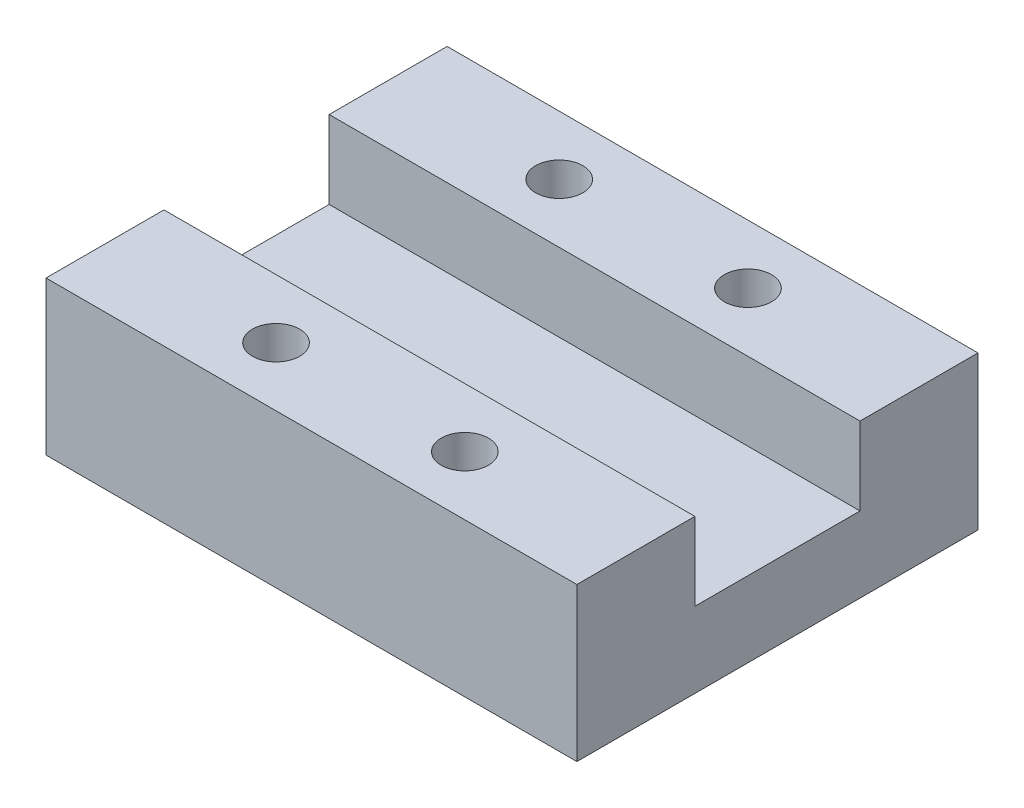
ISO-10303-21;
HEADER;
FILE_DESCRIPTION(('STEP AP214'),'2;1');
FILE_NAME('part.step','',(''),(''),'','','');
FILE_SCHEMA(('AUTOMOTIVE_DESIGN { 1 0 10303 214 1 1 1 1 }'));
ENDSEC;
DATA;
#1=APPLICATION_CONTEXT('core data for automotive mechanical design processes');
#2=APPLICATION_PROTOCOL_DEFINITION('international standard','automotive_design',2000,#1);
#3=PRODUCT_CONTEXT('',#1,'mechanical');
#4=PRODUCT('Part','Part','',(#3));
#5=PRODUCT_RELATED_PRODUCT_CATEGORY('part','',(#4));
#6=PRODUCT_DEFINITION_FORMATION('','',#4);
#7=PRODUCT_DEFINITION_CONTEXT('part definition',#1,'design');
#8=PRODUCT_DEFINITION('design','',#6,#7);
#9=PRODUCT_DEFINITION_SHAPE('','',#8);
#10=(LENGTH_UNIT() NAMED_UNIT(*) SI_UNIT(.MILLI.,.METRE.));
#11=(NAMED_UNIT(*) PLANE_ANGLE_UNIT() SI_UNIT($,.RADIAN.));
#12=(NAMED_UNIT(*) SI_UNIT($,.STERADIAN.) SOLID_ANGLE_UNIT());
#13=UNCERTAINTY_MEASURE_WITH_UNIT(LENGTH_MEASURE(1.E-05),#10,'distance_accuracy_value','');
#14=(GEOMETRIC_REPRESENTATION_CONTEXT(3) GLOBAL_UNCERTAINTY_ASSIGNED_CONTEXT((#13)) GLOBAL_UNIT_ASSIGNED_CONTEXT((#10,
#11,#12)) REPRESENTATION_CONTEXT('',''));
#15=CARTESIAN_POINT('',(0.,0.,0.));
#16=DIRECTION('',(0.,0.,1.));
#17=DIRECTION('',(1.,0.,0.));
#18=AXIS2_PLACEMENT_3D('',#15,#16,#17);
#19=CARTESIAN_POINT('',(0.,3.2,0.));
#20=DIRECTION('',(0.,1.,0.));
#21=DIRECTION('',(0.,0.,1.));
#22=AXIS2_PLACEMENT_3D('',#19,#20,#21);
#23=PLANE('',#22);
#24=DIRECTION('',(0.,0.,1.));
#25=VECTOR('',#24,1.);
#26=CARTESIAN_POINT('',(-11.25,3.2,-8.5));
#27=LINE('',#26,#25);
#28=CARTESIAN_POINT('',(-11.25,3.2,-3.5));
#29=VERTEX_POINT('',#28);
#30=CARTESIAN_POINT('',(-11.25,3.2,3.5));
#31=VERTEX_POINT('',#30);
#32=EDGE_CURVE('E58',#29,#31,#27,.T.);
#33=ORIENTED_EDGE('',*,*,#32,.T.);
#34=DIRECTION('',(-1.,0.,0.));
#35=VECTOR('',#34,1.);
#36=CARTESIAN_POINT('',(-11.25,3.2,3.5));
#37=LINE('',#36,#35);
#38=CARTESIAN_POINT('',(11.25,3.2,3.5));
#39=VERTEX_POINT('',#38);
#40=EDGE_CURVE('E53',#39,#31,#37,.T.);
#41=ORIENTED_EDGE('',*,*,#40,.F.);
#42=DIRECTION('',(0.,0.,-1.));
#43=VECTOR('',#42,1.);
#44=CARTESIAN_POINT('',(11.25,3.2,-8.5));
#45=LINE('',#44,#43);
#46=CARTESIAN_POINT('',(11.25,3.2,-3.5));
#47=VERTEX_POINT('',#46);
#48=EDGE_CURVE('E179',#39,#47,#45,.T.);
#49=ORIENTED_EDGE('',*,*,#48,.T.);
#50=DIRECTION('',(1.,0.,0.));
#51=VECTOR('',#50,1.);
#52=CARTESIAN_POINT('',(-11.25,3.2,-3.5));
#53=LINE('',#52,#51);
#54=EDGE_CURVE('E146',#29,#47,#53,.T.);
#55=ORIENTED_EDGE('',*,*,#54,.F.);
#56=EDGE_LOOP('',(#33,#41,#49,#55));
#57=FACE_BOUND('',#56,.T.);
#58=ADVANCED_FACE('F38',(#57),#23,.T.);
#59=CARTESIAN_POINT('',(0.,0.,0.));
#60=DIRECTION('',(0.,1.,0.));
#61=DIRECTION('',(0.,0.,1.));
#62=AXIS2_PLACEMENT_3D('',#59,#60,#61);
#63=PLANE('',#62);
#64=DIRECTION('',(0.,0.,-1.));
#65=VECTOR('',#64,1.);
#66=CARTESIAN_POINT('',(11.25,0.,-8.5));
#67=LINE('',#66,#65);
#68=CARTESIAN_POINT('',(11.25,0.,8.5));
#69=VERTEX_POINT('',#68);
#70=CARTESIAN_POINT('',(11.25,0.,-8.5));
#71=VERTEX_POINT('',#70);
#72=EDGE_CURVE('E178',#69,#71,#67,.T.);
#73=ORIENTED_EDGE('',*,*,#72,.F.);
#74=DIRECTION('',(1.,0.,0.));
#75=VECTOR('',#74,1.);
#76=CARTESIAN_POINT('',(-11.25,0.,8.5));
#77=LINE('',#76,#75);
#78=CARTESIAN_POINT('',(-11.25,0.,8.5));
#79=VERTEX_POINT('',#78);
#80=EDGE_CURVE('E181',#79,#69,#77,.T.);
#81=ORIENTED_EDGE('',*,*,#80,.F.);
#82=DIRECTION('',(0.,0.,1.));
#83=VECTOR('',#82,1.);
#84=CARTESIAN_POINT('',(-11.25,0.,-8.5));
#85=LINE('',#84,#83);
#86=CARTESIAN_POINT('',(-11.25,0.,-8.5));
#87=VERTEX_POINT('',#86);
#88=EDGE_CURVE('E109',#87,#79,#85,.T.);
#89=ORIENTED_EDGE('',*,*,#88,.F.);
#90=DIRECTION('',(-1.,0.,0.));
#91=VECTOR('',#90,1.);
#92=CARTESIAN_POINT('',(-11.25,0.,-8.5));
#93=LINE('',#92,#91);
#94=EDGE_CURVE('E185',#71,#87,#93,.T.);
#95=ORIENTED_EDGE('',*,*,#94,.F.);
#96=EDGE_LOOP('',(#73,#81,#89,#95));
#97=FACE_BOUND('',#96,.T.);
#98=CARTESIAN_POINT('',(4.,0.,-6.));
#99=DIRECTION('',(0.,1.,0.));
#100=DIRECTION('',(0.,0.,1.));
#101=AXIS2_PLACEMENT_3D('',#98,#99,#100);
#102=CIRCLE('',#101,1.);
#103=CARTESIAN_POINT('',(4.,0.,-5.));
#104=VERTEX_POINT('',#103);
#105=EDGE_CURVE('E175',#104,#104,#102,.T.);
#106=ORIENTED_EDGE('',*,*,#105,.T.);
#107=EDGE_LOOP('',(#106));
#108=FACE_BOUND('',#107,.T.);
#109=CARTESIAN_POINT('',(-4.,0.,-6.));
#110=DIRECTION('',(0.,1.,0.));
#111=DIRECTION('',(0.,0.,1.));
#112=AXIS2_PLACEMENT_3D('',#109,#110,#111);
#113=CIRCLE('',#112,1.);
#114=CARTESIAN_POINT('',(-4.,0.,-5.));
#115=VERTEX_POINT('',#114);
#116=EDGE_CURVE('E172',#115,#115,#113,.T.);
#117=ORIENTED_EDGE('',*,*,#116,.T.);
#118=EDGE_LOOP('',(#117));
#119=FACE_BOUND('',#118,.T.);
#120=CARTESIAN_POINT('',(-4.,0.,6.));
#121=DIRECTION('',(0.,1.,0.));
#122=DIRECTION('',(0.,0.,1.));
#123=AXIS2_PLACEMENT_3D('',#120,#121,#122);
#124=CIRCLE('',#123,1.);
#125=CARTESIAN_POINT('',(-4.,0.,7.));
#126=VERTEX_POINT('',#125);
#127=EDGE_CURVE('E169',#126,#126,#124,.T.);
#128=ORIENTED_EDGE('',*,*,#127,.T.);
#129=EDGE_LOOP('',(#128));
#130=FACE_BOUND('',#129,.T.);
#131=CARTESIAN_POINT('',(4.,0.,6.));
#132=DIRECTION('',(0.,1.,0.));
#133=DIRECTION('',(0.,0.,1.));
#134=AXIS2_PLACEMENT_3D('',#131,#132,#133);
#135=CIRCLE('',#134,1.);
#136=CARTESIAN_POINT('',(4.,0.,7.));
#137=VERTEX_POINT('',#136);
#138=EDGE_CURVE('E166',#137,#137,#135,.T.);
#139=ORIENTED_EDGE('',*,*,#138,.T.);
#140=EDGE_LOOP('',(#139));
#141=FACE_BOUND('',#140,.T.);
#142=ADVANCED_FACE('F195',(#97,#108,#119,#130,#141),#63,.F.);
#143=CARTESIAN_POINT('',(11.25,3.2,-8.5));
#144=DIRECTION('',(-1.,0.,0.));
#145=DIRECTION('',(0.,0.,1.));
#146=AXIS2_PLACEMENT_3D('',#143,#144,#145);
#147=PLANE('',#146);
#148=ORIENTED_EDGE('',*,*,#72,.T.);
#149=DIRECTION('',(0.,-1.,0.));
#150=VECTOR('',#149,1.);
#151=CARTESIAN_POINT('',(11.25,3.2,-8.5));
#152=LINE('',#151,#150);
#153=CARTESIAN_POINT('',(11.25,6.5,-8.5));
#154=VERTEX_POINT('',#153);
#155=EDGE_CURVE('E11',#154,#71,#152,.T.);
#156=ORIENTED_EDGE('',*,*,#155,.F.);
#157=DIRECTION('',(0.,0.,-1.));
#158=VECTOR('',#157,1.);
#159=CARTESIAN_POINT('',(11.25,6.5,-8.5));
#160=LINE('',#159,#158);
#161=CARTESIAN_POINT('',(11.25,6.5,-3.5));
#162=VERTEX_POINT('',#161);
#163=EDGE_CURVE('E152',#162,#154,#160,.T.);
#164=ORIENTED_EDGE('',*,*,#163,.F.);
#165=DIRECTION('',(0.,-1.,0.));
#166=VECTOR('',#165,1.);
#167=CARTESIAN_POINT('',(11.25,6.5,-3.5));
#168=LINE('',#167,#166);
#169=EDGE_CURVE('E158',#162,#47,#168,.T.);
#170=ORIENTED_EDGE('',*,*,#169,.T.);
#171=ORIENTED_EDGE('',*,*,#48,.F.);
#172=DIRECTION('',(0.,-1.,0.));
#173=VECTOR('',#172,1.);
#174=CARTESIAN_POINT('',(11.25,6.5,3.5));
#175=LINE('',#174,#173);
#176=CARTESIAN_POINT('',(11.25,6.5,3.5));
#177=VERTEX_POINT('',#176);
#178=EDGE_CURVE('E137',#177,#39,#175,.T.);
#179=ORIENTED_EDGE('',*,*,#178,.F.);
#180=DIRECTION('',(0.,0.,-1.));
#181=VECTOR('',#180,1.);
#182=CARTESIAN_POINT('',(11.25,6.5,8.5));
#183=LINE('',#182,#181);
#184=CARTESIAN_POINT('',(11.25,6.5,8.5));
#185=VERTEX_POINT('',#184);
#186=EDGE_CURVE('E120',#185,#177,#183,.T.);
#187=ORIENTED_EDGE('',*,*,#186,.F.);
#188=DIRECTION('',(0.,-1.,0.));
#189=VECTOR('',#188,1.);
#190=CARTESIAN_POINT('',(11.25,3.2,8.5));
#191=LINE('',#190,#189);
#192=EDGE_CURVE('E112',#185,#69,#191,.T.);
#193=ORIENTED_EDGE('',*,*,#192,.T.);
#194=EDGE_LOOP('',(#148,#156,#164,#170,#171,#179,#187,#193));
#195=FACE_BOUND('',#194,.T.);
#196=ADVANCED_FACE('F40',(#195),#147,.F.);
#197=CARTESIAN_POINT('',(-11.25,3.2,-8.5));
#198=DIRECTION('',(0.,0.,1.));
#199=DIRECTION('',(1.,0.,0.));
#200=AXIS2_PLACEMENT_3D('',#197,#198,#199);
#201=PLANE('',#200);
#202=ORIENTED_EDGE('',*,*,#94,.T.);
#203=DIRECTION('',(0.,-1.,0.));
#204=VECTOR('',#203,1.);
#205=CARTESIAN_POINT('',(-11.25,3.2,-8.5));
#206=LINE('',#205,#204);
#207=CARTESIAN_POINT('',(-11.25,6.5,-8.5));
#208=VERTEX_POINT('',#207);
#209=EDGE_CURVE('E46',#208,#87,#206,.T.);
#210=ORIENTED_EDGE('',*,*,#209,.F.);
#211=DIRECTION('',(-1.,0.,0.));
#212=VECTOR('',#211,1.);
#213=CARTESIAN_POINT('',(-11.25,6.5,-8.5));
#214=LINE('',#213,#212);
#215=EDGE_CURVE('E155',#154,#208,#214,.T.);
#216=ORIENTED_EDGE('',*,*,#215,.F.);
#217=ORIENTED_EDGE('',*,*,#155,.T.);
#218=EDGE_LOOP('',(#202,#210,#216,#217));
#219=FACE_BOUND('',#218,.T.);
#220=ADVANCED_FACE('F208',(#219),#201,.F.);
#221=CARTESIAN_POINT('',(-11.25,3.2,-8.5));
#222=DIRECTION('',(1.,0.,0.));
#223=DIRECTION('',(0.,0.,-1.));
#224=AXIS2_PLACEMENT_3D('',#221,#222,#223);
#225=PLANE('',#224);
#226=ORIENTED_EDGE('',*,*,#88,.T.);
#227=DIRECTION('',(0.,-1.,0.));
#228=VECTOR('',#227,1.);
#229=CARTESIAN_POINT('',(-11.25,3.2,8.5));
#230=LINE('',#229,#228);
#231=CARTESIAN_POINT('',(-11.25,6.5,8.5));
#232=VERTEX_POINT('',#231);
#233=EDGE_CURVE('E101',#232,#79,#230,.T.);
#234=ORIENTED_EDGE('',*,*,#233,.F.);
#235=DIRECTION('',(0.,0.,1.));
#236=VECTOR('',#235,1.);
#237=CARTESIAN_POINT('',(-11.25,6.5,8.5));
#238=LINE('',#237,#236);
#239=CARTESIAN_POINT('',(-11.25,6.5,3.5));
#240=VERTEX_POINT('',#239);
#241=EDGE_CURVE('E106',#240,#232,#238,.T.);
#242=ORIENTED_EDGE('',*,*,#241,.F.);
#243=DIRECTION('',(0.,-1.,0.));
#244=VECTOR('',#243,1.);
#245=CARTESIAN_POINT('',(-11.25,6.5,3.5));
#246=LINE('',#245,#244);
#247=EDGE_CURVE('E134',#240,#31,#246,.T.);
#248=ORIENTED_EDGE('',*,*,#247,.T.);
#249=ORIENTED_EDGE('',*,*,#32,.F.);
#250=DIRECTION('',(0.,-1.,0.));
#251=VECTOR('',#250,1.);
#252=CARTESIAN_POINT('',(-11.25,6.5,-3.5));
#253=LINE('',#252,#251);
#254=CARTESIAN_POINT('',(-11.25,6.5,-3.5));
#255=VERTEX_POINT('',#254);
#256=EDGE_CURVE('E163',#255,#29,#253,.T.);
#257=ORIENTED_EDGE('',*,*,#256,.F.);
#258=DIRECTION('',(0.,0.,1.));
#259=VECTOR('',#258,1.);
#260=CARTESIAN_POINT('',(-11.25,6.5,-8.5));
#261=LINE('',#260,#259);
#262=EDGE_CURVE('E147',#208,#255,#261,.T.);
#263=ORIENTED_EDGE('',*,*,#262,.F.);
#264=ORIENTED_EDGE('',*,*,#209,.T.);
#265=EDGE_LOOP('',(#226,#234,#242,#248,#249,#257,#263,#264));
#266=FACE_BOUND('',#265,.T.);
#267=ADVANCED_FACE('F103',(#266),#225,.F.);
#268=CARTESIAN_POINT('',(-11.25,3.2,8.5));
#269=DIRECTION('',(0.,0.,-1.));
#270=DIRECTION('',(-1.,0.,0.));
#271=AXIS2_PLACEMENT_3D('',#268,#269,#270);
#272=PLANE('',#271);
#273=ORIENTED_EDGE('',*,*,#80,.T.);
#274=ORIENTED_EDGE('',*,*,#192,.F.);
#275=DIRECTION('',(1.,0.,0.));
#276=VECTOR('',#275,1.);
#277=CARTESIAN_POINT('',(-11.25,6.5,8.5));
#278=LINE('',#277,#276);
#279=EDGE_CURVE('E115',#232,#185,#278,.T.);
#280=ORIENTED_EDGE('',*,*,#279,.F.);
#281=ORIENTED_EDGE('',*,*,#233,.T.);
#282=EDGE_LOOP('',(#273,#274,#280,#281));
#283=FACE_BOUND('',#282,.T.);
#284=ADVANCED_FACE('F116',(#283),#272,.F.);
#285=CARTESIAN_POINT('',(4.,3.2,-6.));
#286=DIRECTION('',(0.,-1.,0.));
#287=DIRECTION('',(0.,0.,-1.));
#288=AXIS2_PLACEMENT_3D('',#285,#286,#287);
#289=CYLINDRICAL_SURFACE('',#288,1.);
#290=ORIENTED_EDGE('',*,*,#105,.F.);
#291=EDGE_LOOP('',(#290));
#292=FACE_BOUND('',#291,.T.);
#293=CARTESIAN_POINT('',(4.,6.5,-6.));
#294=DIRECTION('',(0.,1.,0.));
#295=DIRECTION('',(0.,0.,1.));
#296=AXIS2_PLACEMENT_3D('',#293,#294,#295);
#297=CIRCLE('',#296,1.);
#298=CARTESIAN_POINT('',(4.,6.5,-5.));
#299=VERTEX_POINT('',#298);
#300=EDGE_CURVE('E140',#299,#299,#297,.T.);
#301=ORIENTED_EDGE('',*,*,#300,.T.);
#302=EDGE_LOOP('',(#301));
#303=FACE_BOUND('',#302,.T.);
#304=ADVANCED_FACE('F222',(#292,#303),#289,.F.);
#305=CARTESIAN_POINT('',(-4.,3.2,-6.));
#306=DIRECTION('',(0.,-1.,0.));
#307=DIRECTION('',(0.,0.,-1.));
#308=AXIS2_PLACEMENT_3D('',#305,#306,#307);
#309=CYLINDRICAL_SURFACE('',#308,1.);
#310=ORIENTED_EDGE('',*,*,#116,.F.);
#311=EDGE_LOOP('',(#310));
#312=FACE_BOUND('',#311,.T.);
#313=CARTESIAN_POINT('',(-4.,6.5,-6.));
#314=DIRECTION('',(0.,1.,0.));
#315=DIRECTION('',(0.,0.,1.));
#316=AXIS2_PLACEMENT_3D('',#313,#314,#315);
#317=CIRCLE('',#316,1.);
#318=CARTESIAN_POINT('',(-4.,6.5,-5.));
#319=VERTEX_POINT('',#318);
#320=EDGE_CURVE('E143',#319,#319,#317,.T.);
#321=ORIENTED_EDGE('',*,*,#320,.T.);
#322=EDGE_LOOP('',(#321));
#323=FACE_BOUND('',#322,.T.);
#324=ADVANCED_FACE('F229',(#312,#323),#309,.F.);
#325=CARTESIAN_POINT('',(-4.,3.2,6.));
#326=DIRECTION('',(0.,-1.,0.));
#327=DIRECTION('',(0.,0.,-1.));
#328=AXIS2_PLACEMENT_3D('',#325,#326,#327);
#329=CYLINDRICAL_SURFACE('',#328,1.);
#330=ORIENTED_EDGE('',*,*,#127,.F.);
#331=EDGE_LOOP('',(#330));
#332=FACE_BOUND('',#331,.T.);
#333=CARTESIAN_POINT('',(-4.,6.5,6.));
#334=DIRECTION('',(0.,1.,0.));
#335=DIRECTION('',(0.,0.,1.));
#336=AXIS2_PLACEMENT_3D('',#333,#334,#335);
#337=CIRCLE('',#336,1.);
#338=CARTESIAN_POINT('',(-4.,6.5,7.));
#339=VERTEX_POINT('',#338);
#340=EDGE_CURVE('E128',#339,#339,#337,.T.);
#341=ORIENTED_EDGE('',*,*,#340,.T.);
#342=EDGE_LOOP('',(#341));
#343=FACE_BOUND('',#342,.T.);
#344=ADVANCED_FACE('F234',(#332,#343),#329,.F.);
#345=CARTESIAN_POINT('',(4.,3.2,6.));
#346=DIRECTION('',(0.,-1.,0.));
#347=DIRECTION('',(0.,0.,-1.));
#348=AXIS2_PLACEMENT_3D('',#345,#346,#347);
#349=CYLINDRICAL_SURFACE('',#348,1.);
#350=ORIENTED_EDGE('',*,*,#138,.F.);
#351=EDGE_LOOP('',(#350));
#352=FACE_BOUND('',#351,.T.);
#353=CARTESIAN_POINT('',(4.,6.5,6.));
#354=DIRECTION('',(0.,1.,0.));
#355=DIRECTION('',(0.,0.,1.));
#356=AXIS2_PLACEMENT_3D('',#353,#354,#355);
#357=CIRCLE('',#356,1.);
#358=CARTESIAN_POINT('',(4.,6.5,7.));
#359=VERTEX_POINT('',#358);
#360=EDGE_CURVE('E262',#359,#359,#357,.T.);
#361=ORIENTED_EDGE('',*,*,#360,.T.);
#362=EDGE_LOOP('',(#361));
#363=FACE_BOUND('',#362,.T.);
#364=ADVANCED_FACE('F240',(#352,#363),#349,.F.);
#365=CARTESIAN_POINT('',(0.,6.5,0.));
#366=DIRECTION('',(0.,1.,0.));
#367=DIRECTION('',(0.,0.,1.));
#368=AXIS2_PLACEMENT_3D('',#365,#366,#367);
#369=PLANE('',#368);
#370=ORIENTED_EDGE('',*,*,#320,.F.);
#371=EDGE_LOOP('',(#370));
#372=FACE_BOUND('',#371,.T.);
#373=ORIENTED_EDGE('',*,*,#262,.T.);
#374=DIRECTION('',(1.,0.,0.));
#375=VECTOR('',#374,1.);
#376=CARTESIAN_POINT('',(-11.25,6.5,-3.5));
#377=LINE('',#376,#375);
#378=EDGE_CURVE('E150',#255,#162,#377,.T.);
#379=ORIENTED_EDGE('',*,*,#378,.T.);
#380=ORIENTED_EDGE('',*,*,#163,.T.);
#381=ORIENTED_EDGE('',*,*,#215,.T.);
#382=EDGE_LOOP('',(#373,#379,#380,#381));
#383=FACE_BOUND('',#382,.T.);
#384=ORIENTED_EDGE('',*,*,#300,.F.);
#385=EDGE_LOOP('',(#384));
#386=FACE_BOUND('',#385,.T.);
#387=ADVANCED_FACE('F206',(#372,#383,#386),#369,.T.);
#388=CARTESIAN_POINT('',(-11.25,6.5,-3.5));
#389=DIRECTION('',(0.,0.,-1.));
#390=DIRECTION('',(-1.,0.,0.));
#391=AXIS2_PLACEMENT_3D('',#388,#389,#390);
#392=PLANE('',#391);
#393=ORIENTED_EDGE('',*,*,#54,.T.);
#394=ORIENTED_EDGE('',*,*,#169,.F.);
#395=ORIENTED_EDGE('',*,*,#378,.F.);
#396=ORIENTED_EDGE('',*,*,#256,.T.);
#397=EDGE_LOOP('',(#393,#394,#395,#396));
#398=FACE_BOUND('',#397,.T.);
#399=ADVANCED_FACE('F202',(#398),#392,.F.);
#400=CARTESIAN_POINT('',(0.,6.5,0.));
#401=DIRECTION('',(0.,-1.,0.));
#402=DIRECTION('',(0.,0.,-1.));
#403=AXIS2_PLACEMENT_3D('',#400,#401,#402);
#404=PLANE('',#403);
#405=ORIENTED_EDGE('',*,*,#241,.T.);
#406=ORIENTED_EDGE('',*,*,#279,.T.);
#407=ORIENTED_EDGE('',*,*,#186,.T.);
#408=DIRECTION('',(-1.,0.,0.));
#409=VECTOR('',#408,1.);
#410=CARTESIAN_POINT('',(-11.25,6.5,3.5));
#411=LINE('',#410,#409);
#412=EDGE_CURVE('E125',#177,#240,#411,.T.);
#413=ORIENTED_EDGE('',*,*,#412,.T.);
#414=EDGE_LOOP('',(#405,#406,#407,#413));
#415=FACE_BOUND('',#414,.T.);
#416=ORIENTED_EDGE('',*,*,#340,.F.);
#417=EDGE_LOOP('',(#416));
#418=FACE_BOUND('',#417,.T.);
#419=ORIENTED_EDGE('',*,*,#360,.F.);
#420=EDGE_LOOP('',(#419));
#421=FACE_BOUND('',#420,.T.);
#422=ADVANCED_FACE('F122',(#415,#418,#421),#404,.F.);
#423=CARTESIAN_POINT('',(-11.25,6.5,3.5));
#424=DIRECTION('',(0.,0.,1.));
#425=DIRECTION('',(1.,0.,0.));
#426=AXIS2_PLACEMENT_3D('',#423,#424,#425);
#427=PLANE('',#426);
#428=ORIENTED_EDGE('',*,*,#40,.T.);
#429=ORIENTED_EDGE('',*,*,#247,.F.);
#430=ORIENTED_EDGE('',*,*,#412,.F.);
#431=ORIENTED_EDGE('',*,*,#178,.T.);
#432=EDGE_LOOP('',(#428,#429,#430,#431));
#433=FACE_BOUND('',#432,.T.);
#434=ADVANCED_FACE('F200',(#433),#427,.F.);
#435=CLOSED_SHELL('',(#58,#142,#196,#220,#267,#284,#304,#324,#344,#364,#387,#399,#422,#434));
#436=MANIFOLD_SOLID_BREP('B2',#435);
#437=ADVANCED_BREP_SHAPE_REPRESENTATION('',(#18,#436),#14);
#438=SHAPE_DEFINITION_REPRESENTATION(#9,#437);
ENDSEC;
END-ISO-10303-21;
